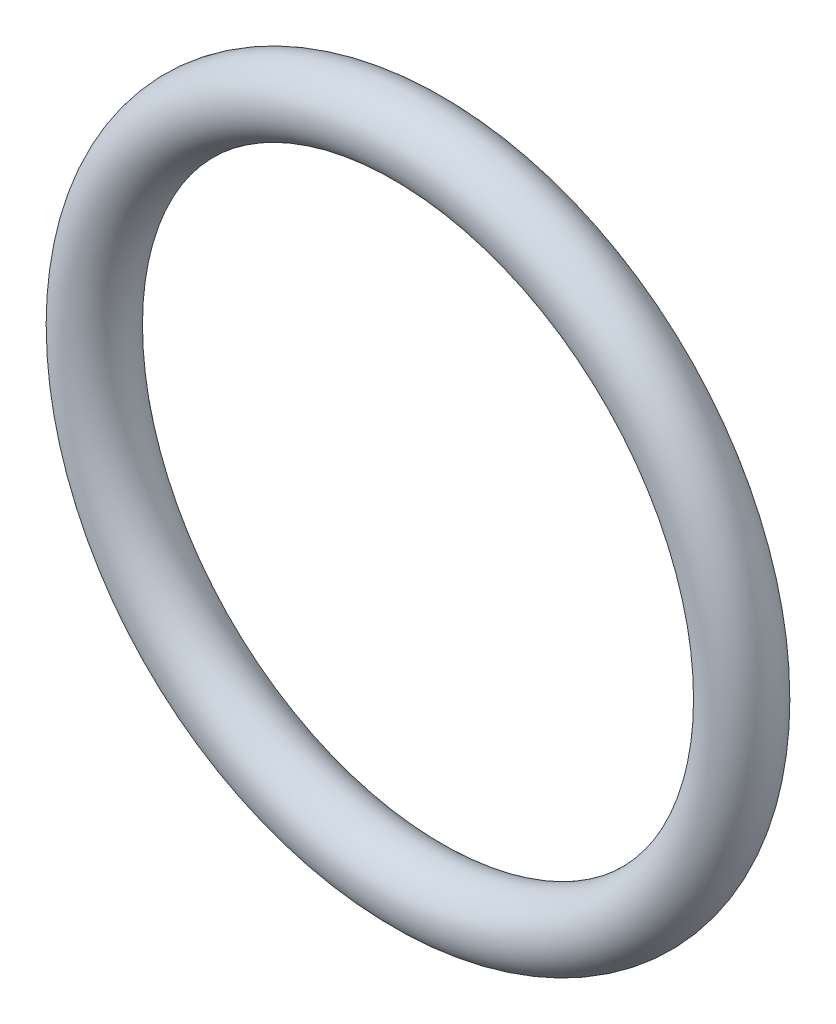
ISO-10303-21;
HEADER;
FILE_DESCRIPTION(('STEP AP214'),'2;1');
FILE_NAME('part.step','',(''),(''),'','','');
FILE_SCHEMA(('AUTOMOTIVE_DESIGN { 1 0 10303 214 1 1 1 1 }'));
ENDSEC;
DATA;
#1=APPLICATION_CONTEXT('core data for automotive mechanical design processes');
#2=APPLICATION_PROTOCOL_DEFINITION('international standard','automotive_design',2000,#1);
#3=PRODUCT_CONTEXT('',#1,'mechanical');
#4=PRODUCT('Part','Part','',(#3));
#5=PRODUCT_RELATED_PRODUCT_CATEGORY('part','',(#4));
#6=PRODUCT_DEFINITION_FORMATION('','',#4);
#7=PRODUCT_DEFINITION_CONTEXT('part definition',#1,'design');
#8=PRODUCT_DEFINITION('design','',#6,#7);
#9=PRODUCT_DEFINITION_SHAPE('','',#8);
#10=(LENGTH_UNIT() NAMED_UNIT(*) SI_UNIT(.MILLI.,.METRE.));
#11=(NAMED_UNIT(*) PLANE_ANGLE_UNIT() SI_UNIT($,.RADIAN.));
#12=(NAMED_UNIT(*) SI_UNIT($,.STERADIAN.) SOLID_ANGLE_UNIT());
#13=UNCERTAINTY_MEASURE_WITH_UNIT(LENGTH_MEASURE(1.E-05),#10,'distance_accuracy_value','');
#14=(GEOMETRIC_REPRESENTATION_CONTEXT(3) GLOBAL_UNCERTAINTY_ASSIGNED_CONTEXT((#13)) GLOBAL_UNIT_ASSIGNED_CONTEXT((#10,
#11,#12)) REPRESENTATION_CONTEXT('',''));
#15=CARTESIAN_POINT('',(0.,0.,0.));
#16=DIRECTION('',(0.,0.,1.));
#17=DIRECTION('',(1.,0.,0.));
#18=AXIS2_PLACEMENT_3D('',#15,#16,#17);
#19=CARTESIAN_POINT('',(0.,0.,0.));
#20=DIRECTION('',(0.,0.,1.));
#21=DIRECTION('',(1.,0.,0.));
#22=AXIS2_PLACEMENT_3D('',#19,#20,#21);
#23=TOROIDAL_SURFACE('',#22,9.5,1.);
#24=CARTESIAN_POINT('',(10.5,0.,0.));
#25=VERTEX_POINT('',#24);
#26=VERTEX_LOOP('',#25);
#27=FACE_BOUND('',#26,.T.);
#28=ADVANCED_FACE('F28',(#27),#23,.T.);
#29=CLOSED_SHELL('',(#28));
#30=MANIFOLD_SOLID_BREP('B2',#29);
#31=ADVANCED_BREP_SHAPE_REPRESENTATION('',(#18,#30),#14);
#32=SHAPE_DEFINITION_REPRESENTATION(#9,#31);
ENDSEC;
END-ISO-10303-21;
